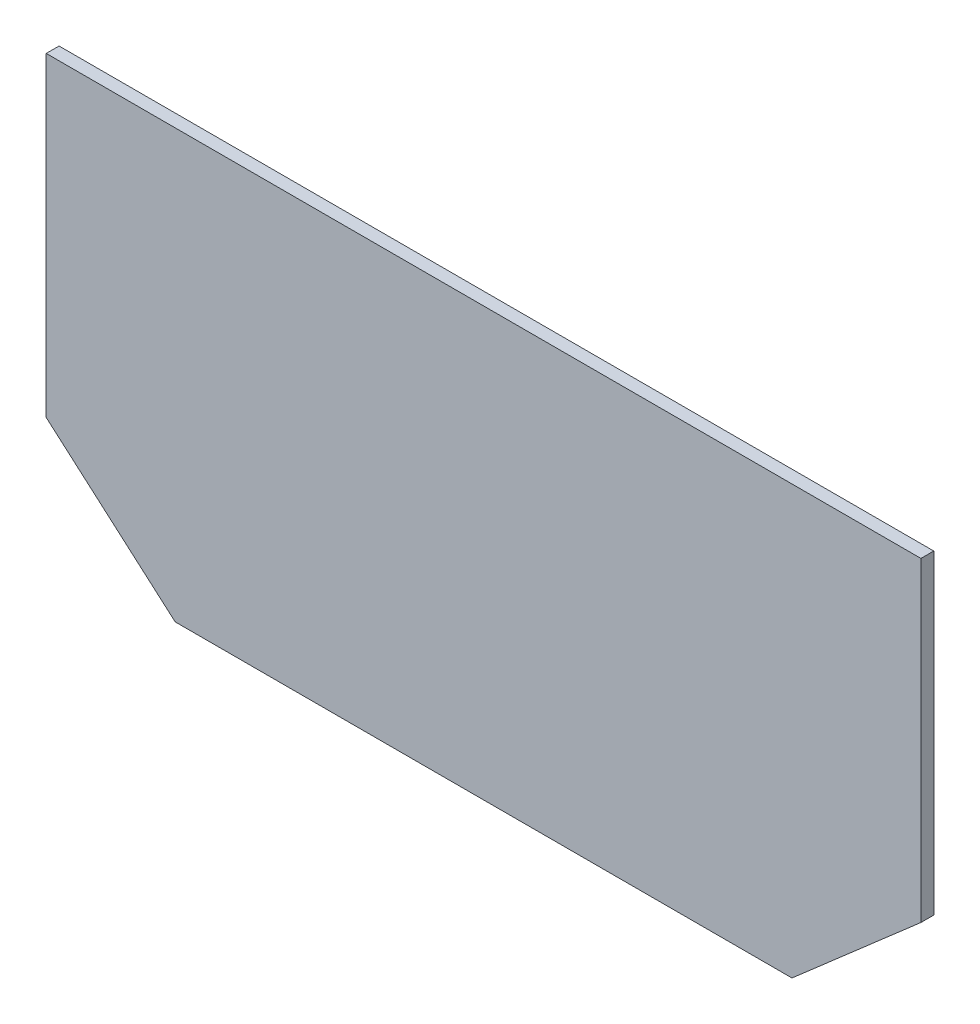
ISO-10303-21;
HEADER;
FILE_DESCRIPTION(('STEP AP214'),'2;1');
FILE_NAME('part.step','',(''),(''),'','','');
FILE_SCHEMA(('AUTOMOTIVE_DESIGN { 1 0 10303 214 1 1 1 1 }'));
ENDSEC;
DATA;
#1=APPLICATION_CONTEXT('core data for automotive mechanical design processes');
#2=APPLICATION_PROTOCOL_DEFINITION('international standard','automotive_design',2000,#1);
#3=PRODUCT_CONTEXT('',#1,'mechanical');
#4=PRODUCT('Part','Part','',(#3));
#5=PRODUCT_RELATED_PRODUCT_CATEGORY('part','',(#4));
#6=PRODUCT_DEFINITION_FORMATION('','',#4);
#7=PRODUCT_DEFINITION_CONTEXT('part definition',#1,'design');
#8=PRODUCT_DEFINITION('design','',#6,#7);
#9=PRODUCT_DEFINITION_SHAPE('','',#8);
#10=(LENGTH_UNIT() NAMED_UNIT(*) SI_UNIT(.MILLI.,.METRE.));
#11=(NAMED_UNIT(*) PLANE_ANGLE_UNIT() SI_UNIT($,.RADIAN.));
#12=(NAMED_UNIT(*) SI_UNIT($,.STERADIAN.) SOLID_ANGLE_UNIT());
#13=UNCERTAINTY_MEASURE_WITH_UNIT(LENGTH_MEASURE(1.E-05),#10,'distance_accuracy_value','');
#14=(GEOMETRIC_REPRESENTATION_CONTEXT(3) GLOBAL_UNCERTAINTY_ASSIGNED_CONTEXT((#13)) GLOBAL_UNIT_ASSIGNED_CONTEXT((#10,
#11,#12)) REPRESENTATION_CONTEXT('',''));
#15=CARTESIAN_POINT('',(0.,0.,0.));
#16=DIRECTION('',(0.,0.,1.));
#17=DIRECTION('',(1.,0.,0.));
#18=AXIS2_PLACEMENT_3D('',#15,#16,#17);
#19=CARTESIAN_POINT('',(-204.437741990284,-50.0000000000001,6.));
#20=DIRECTION('',(1.,0.,0.));
#21=DIRECTION('',(0.,0.,-1.));
#22=AXIS2_PLACEMENT_3D('',#19,#20,#21);
#23=PLANE('',#22);
#24=DIRECTION('',(0.,-1.,0.));
#25=VECTOR('',#24,1.);
#26=CARTESIAN_POINT('',(-204.437741990284,-50.0000000000001,0.));
#27=LINE('',#26,#25);
#28=CARTESIAN_POINT('',(-204.437741990284,-50.0000000000001,0.));
#29=VERTEX_POINT('',#28);
#30=CARTESIAN_POINT('',(-204.437741990284,-197.402134184378,0.));
#31=VERTEX_POINT('',#30);
#32=EDGE_CURVE('E120',#29,#31,#27,.T.);
#33=ORIENTED_EDGE('',*,*,#32,.T.);
#34=DIRECTION('',(0.,0.,-1.));
#35=VECTOR('',#34,1.);
#36=CARTESIAN_POINT('',(-204.437741990284,-197.402134184378,6.));
#37=LINE('',#36,#35);
#38=CARTESIAN_POINT('',(-204.437741990284,-197.402134184378,6.));
#39=VERTEX_POINT('',#38);
#40=EDGE_CURVE('E11',#39,#31,#37,.T.);
#41=ORIENTED_EDGE('',*,*,#40,.F.);
#42=DIRECTION('',(0.,-1.,0.));
#43=VECTOR('',#42,1.);
#44=CARTESIAN_POINT('',(-204.437741990284,-50.0000000000001,6.));
#45=LINE('',#44,#43);
#46=CARTESIAN_POINT('',(-204.437741990284,-50.0000000000001,6.));
#47=VERTEX_POINT('',#46);
#48=EDGE_CURVE('E130',#47,#39,#45,.T.);
#49=ORIENTED_EDGE('',*,*,#48,.F.);
#50=DIRECTION('',(0.,0.,-1.));
#51=VECTOR('',#50,1.);
#52=CARTESIAN_POINT('',(-204.437741990284,-50.0000000000001,6.));
#53=LINE('',#52,#51);
#54=EDGE_CURVE('E116',#47,#29,#53,.T.);
#55=ORIENTED_EDGE('',*,*,#54,.T.);
#56=EDGE_LOOP('',(#33,#41,#49,#55));
#57=FACE_BOUND('',#56,.T.);
#58=ADVANCED_FACE('F36',(#57),#23,.F.);
#59=CARTESIAN_POINT('',(-204.437741990284,-197.402134184378,6.));
#60=DIRECTION('',(0.657473322695291,0.753477823126874,0.));
#61=DIRECTION('',(-0.753477823126874,0.657473322695291,0.));
#62=AXIS2_PLACEMENT_3D('',#59,#60,#61);
#63=PLANE('',#62);
#64=DIRECTION('',(0.753477823126874,-0.657473322695291,0.));
#65=VECTOR('',#64,1.);
#66=CARTESIAN_POINT('',(-204.437741990284,-197.402134184378,0.));
#67=LINE('',#66,#65);
#68=CARTESIAN_POINT('',(-144.159516140136,-250.,0.));
#69=VERTEX_POINT('',#68);
#70=EDGE_CURVE('E123',#31,#69,#67,.T.);
#71=ORIENTED_EDGE('',*,*,#70,.T.);
#72=DIRECTION('',(0.,0.,-1.));
#73=VECTOR('',#72,1.);
#74=CARTESIAN_POINT('',(-144.159516140136,-250.,6.));
#75=LINE('',#74,#73);
#76=CARTESIAN_POINT('',(-144.159516140136,-250.,6.));
#77=VERTEX_POINT('',#76);
#78=EDGE_CURVE('E44',#77,#69,#75,.T.);
#79=ORIENTED_EDGE('',*,*,#78,.F.);
#80=DIRECTION('',(0.753477823126874,-0.657473322695291,0.));
#81=VECTOR('',#80,1.);
#82=CARTESIAN_POINT('',(-204.437741990284,-197.402134184378,6.));
#83=LINE('',#82,#81);
#84=EDGE_CURVE('E89',#39,#77,#83,.T.);
#85=ORIENTED_EDGE('',*,*,#84,.F.);
#86=ORIENTED_EDGE('',*,*,#40,.T.);
#87=EDGE_LOOP('',(#71,#79,#85,#86));
#88=FACE_BOUND('',#87,.T.);
#89=ADVANCED_FACE('F154',(#88),#63,.F.);
#90=CARTESIAN_POINT('',(-144.159516140136,-250.,6.));
#91=DIRECTION('',(0.,1.,0.));
#92=DIRECTION('',(0.,0.,1.));
#93=AXIS2_PLACEMENT_3D('',#90,#91,#92);
#94=PLANE('',#93);
#95=DIRECTION('',(1.,0.,0.));
#96=VECTOR('',#95,1.);
#97=CARTESIAN_POINT('',(-144.159516140136,-250.,0.));
#98=LINE('',#97,#96);
#99=CARTESIAN_POINT('',(144.159516140136,-250.,0.));
#100=VERTEX_POINT('',#99);
#101=EDGE_CURVE('E125',#69,#100,#98,.T.);
#102=ORIENTED_EDGE('',*,*,#101,.T.);
#103=DIRECTION('',(0.,0.,-1.));
#104=VECTOR('',#103,1.);
#105=CARTESIAN_POINT('',(144.159516140136,-250.,6.));
#106=LINE('',#105,#104);
#107=CARTESIAN_POINT('',(144.159516140136,-250.,6.));
#108=VERTEX_POINT('',#107);
#109=EDGE_CURVE('E111',#108,#100,#106,.T.);
#110=ORIENTED_EDGE('',*,*,#109,.F.);
#111=DIRECTION('',(1.,0.,0.));
#112=VECTOR('',#111,1.);
#113=CARTESIAN_POINT('',(-144.159516140136,-250.,6.));
#114=LINE('',#113,#112);
#115=EDGE_CURVE('E102',#77,#108,#114,.T.);
#116=ORIENTED_EDGE('',*,*,#115,.F.);
#117=ORIENTED_EDGE('',*,*,#78,.T.);
#118=EDGE_LOOP('',(#102,#110,#116,#117));
#119=FACE_BOUND('',#118,.T.);
#120=ADVANCED_FACE('F136',(#119),#94,.F.);
#121=CARTESIAN_POINT('',(204.437741990283,-197.402134184379,6.));
#122=DIRECTION('',(-0.657473322695292,0.753477823126874,0.));
#123=DIRECTION('',(-0.753477823126874,-0.657473322695292,0.));
#124=AXIS2_PLACEMENT_3D('',#121,#122,#123);
#125=PLANE('',#124);
#126=DIRECTION('',(0.753477823126874,0.657473322695292,0.));
#127=VECTOR('',#126,1.);
#128=CARTESIAN_POINT('',(204.437741990283,-197.402134184379,0.));
#129=LINE('',#128,#127);
#130=CARTESIAN_POINT('',(204.437741990283,-197.402134184379,0.));
#131=VERTEX_POINT('',#130);
#132=EDGE_CURVE('E110',#100,#131,#129,.T.);
#133=ORIENTED_EDGE('',*,*,#132,.T.);
#134=DIRECTION('',(0.,0.,-1.));
#135=VECTOR('',#134,1.);
#136=CARTESIAN_POINT('',(204.437741990283,-197.402134184379,6.));
#137=LINE('',#136,#135);
#138=CARTESIAN_POINT('',(204.437741990283,-197.402134184379,6.));
#139=VERTEX_POINT('',#138);
#140=EDGE_CURVE('E107',#139,#131,#137,.T.);
#141=ORIENTED_EDGE('',*,*,#140,.F.);
#142=DIRECTION('',(0.753477823126874,0.657473322695292,0.));
#143=VECTOR('',#142,1.);
#144=CARTESIAN_POINT('',(204.437741990283,-197.402134184379,6.));
#145=LINE('',#144,#143);
#146=EDGE_CURVE('E96',#108,#139,#145,.T.);
#147=ORIENTED_EDGE('',*,*,#146,.F.);
#148=ORIENTED_EDGE('',*,*,#109,.T.);
#149=EDGE_LOOP('',(#133,#141,#147,#148));
#150=FACE_BOUND('',#149,.T.);
#151=ADVANCED_FACE('F108',(#150),#125,.F.);
#152=CARTESIAN_POINT('',(204.437741990283,-50.0000000000001,6.));
#153=DIRECTION('',(-1.,0.,0.));
#154=DIRECTION('',(0.,-1.,0.));
#155=AXIS2_PLACEMENT_3D('',#152,#153,#154);
#156=PLANE('',#155);
#157=DIRECTION('',(0.,1.,0.));
#158=VECTOR('',#157,1.);
#159=CARTESIAN_POINT('',(204.437741990283,-50.0000000000001,0.));
#160=LINE('',#159,#158);
#161=CARTESIAN_POINT('',(204.437741990283,-50.0000000000001,0.));
#162=VERTEX_POINT('',#161);
#163=EDGE_CURVE('E75',#131,#162,#160,.T.);
#164=ORIENTED_EDGE('',*,*,#163,.T.);
#165=DIRECTION('',(0.,0.,-1.));
#166=VECTOR('',#165,1.);
#167=CARTESIAN_POINT('',(204.437741990283,-50.0000000000001,6.));
#168=LINE('',#167,#166);
#169=CARTESIAN_POINT('',(204.437741990283,-50.0000000000001,6.));
#170=VERTEX_POINT('',#169);
#171=EDGE_CURVE('E112',#170,#162,#168,.T.);
#172=ORIENTED_EDGE('',*,*,#171,.F.);
#173=DIRECTION('',(0.,1.,0.));
#174=VECTOR('',#173,1.);
#175=CARTESIAN_POINT('',(204.437741990283,-50.0000000000001,6.));
#176=LINE('',#175,#174);
#177=EDGE_CURVE('E100',#139,#170,#176,.T.);
#178=ORIENTED_EDGE('',*,*,#177,.F.);
#179=ORIENTED_EDGE('',*,*,#140,.T.);
#180=EDGE_LOOP('',(#164,#172,#178,#179));
#181=FACE_BOUND('',#180,.T.);
#182=ADVANCED_FACE('F114',(#181),#156,.F.);
#183=CARTESIAN_POINT('',(-204.437741990284,-50.0000000000001,6.));
#184=DIRECTION('',(0.,-1.,0.));
#185=DIRECTION('',(0.,0.,-1.));
#186=AXIS2_PLACEMENT_3D('',#183,#184,#185);
#187=PLANE('',#186);
#188=DIRECTION('',(-1.,0.,0.));
#189=VECTOR('',#188,1.);
#190=CARTESIAN_POINT('',(-204.437741990284,-50.0000000000001,0.));
#191=LINE('',#190,#189);
#192=EDGE_CURVE('E81',#162,#29,#191,.T.);
#193=ORIENTED_EDGE('',*,*,#192,.T.);
#194=ORIENTED_EDGE('',*,*,#54,.F.);
#195=DIRECTION('',(-1.,0.,0.));
#196=VECTOR('',#195,1.);
#197=CARTESIAN_POINT('',(-204.437741990284,-50.0000000000001,6.));
#198=LINE('',#197,#196);
#199=EDGE_CURVE('E52',#170,#47,#198,.T.);
#200=ORIENTED_EDGE('',*,*,#199,.F.);
#201=ORIENTED_EDGE('',*,*,#171,.T.);
#202=EDGE_LOOP('',(#193,#194,#200,#201));
#203=FACE_BOUND('',#202,.T.);
#204=ADVANCED_FACE('F143',(#203),#187,.F.);
#205=CARTESIAN_POINT('',(0.,0.,6.));
#206=DIRECTION('',(0.,0.,1.));
#207=DIRECTION('',(1.,0.,0.));
#208=AXIS2_PLACEMENT_3D('',#205,#206,#207);
#209=PLANE('',#208);
#210=ORIENTED_EDGE('',*,*,#48,.T.);
#211=ORIENTED_EDGE('',*,*,#84,.T.);
#212=ORIENTED_EDGE('',*,*,#115,.T.);
#213=ORIENTED_EDGE('',*,*,#146,.T.);
#214=ORIENTED_EDGE('',*,*,#177,.T.);
#215=ORIENTED_EDGE('',*,*,#199,.T.);
#216=EDGE_LOOP('',(#210,#211,#212,#213,#214,#215));
#217=FACE_BOUND('',#216,.T.);
#218=ADVANCED_FACE('F98',(#217),#209,.T.);
#219=CARTESIAN_POINT('',(0.,0.,0.));
#220=DIRECTION('',(0.,0.,1.));
#221=DIRECTION('',(1.,0.,0.));
#222=AXIS2_PLACEMENT_3D('',#219,#220,#221);
#223=PLANE('',#222);
#224=ORIENTED_EDGE('',*,*,#32,.F.);
#225=ORIENTED_EDGE('',*,*,#192,.F.);
#226=ORIENTED_EDGE('',*,*,#163,.F.);
#227=ORIENTED_EDGE('',*,*,#132,.F.);
#228=ORIENTED_EDGE('',*,*,#101,.F.);
#229=ORIENTED_EDGE('',*,*,#70,.F.);
#230=EDGE_LOOP('',(#224,#225,#226,#227,#228,#229));
#231=FACE_BOUND('',#230,.T.);
#232=ADVANCED_FACE('F139',(#231),#223,.F.);
#233=CLOSED_SHELL('',(#58,#89,#120,#151,#182,#204,#218,#232));
#234=MANIFOLD_SOLID_BREP('B2',#233);
#235=ADVANCED_BREP_SHAPE_REPRESENTATION('',(#18,#234),#14);
#236=SHAPE_DEFINITION_REPRESENTATION(#9,#235);
ENDSEC;
END-ISO-10303-21;
